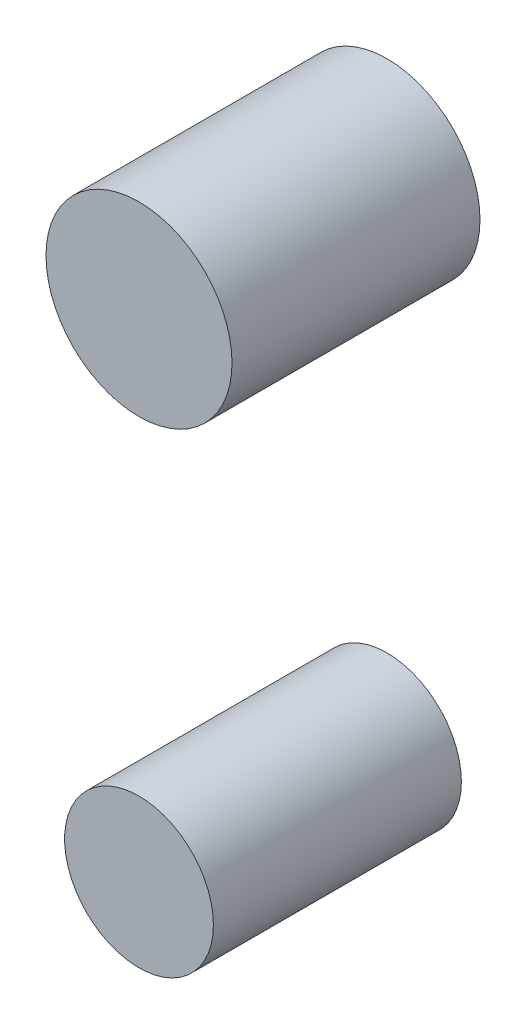
ISO-10303-21;
HEADER;
FILE_DESCRIPTION(('STEP AP214'),'2;1');
FILE_NAME('part.step','',(''),(''),'','','');
FILE_SCHEMA(('AUTOMOTIVE_DESIGN { 1 0 10303 214 1 1 1 1 }'));
ENDSEC;
DATA;
#1=APPLICATION_CONTEXT('core data for automotive mechanical design processes');
#2=APPLICATION_PROTOCOL_DEFINITION('international standard','automotive_design',2000,#1);
#3=PRODUCT_CONTEXT('',#1,'mechanical');
#4=PRODUCT('Part','Part','',(#3));
#5=PRODUCT_RELATED_PRODUCT_CATEGORY('part','',(#4));
#6=PRODUCT_DEFINITION_FORMATION('','',#4);
#7=PRODUCT_DEFINITION_CONTEXT('part definition',#1,'design');
#8=PRODUCT_DEFINITION('design','',#6,#7);
#9=PRODUCT_DEFINITION_SHAPE('','',#8);
#10=(LENGTH_UNIT() NAMED_UNIT(*) SI_UNIT(.MILLI.,.METRE.));
#11=(NAMED_UNIT(*) PLANE_ANGLE_UNIT() SI_UNIT($,.RADIAN.));
#12=(NAMED_UNIT(*) SI_UNIT($,.STERADIAN.) SOLID_ANGLE_UNIT());
#13=UNCERTAINTY_MEASURE_WITH_UNIT(LENGTH_MEASURE(1.E-05),#10,'distance_accuracy_value','');
#14=(GEOMETRIC_REPRESENTATION_CONTEXT(3) GLOBAL_UNCERTAINTY_ASSIGNED_CONTEXT((#13)) GLOBAL_UNIT_ASSIGNED_CONTEXT((#10,
#11,#12)) REPRESENTATION_CONTEXT('',''));
#15=CARTESIAN_POINT('',(0.,0.,0.));
#16=DIRECTION('',(0.,0.,1.));
#17=DIRECTION('',(1.,0.,0.));
#18=AXIS2_PLACEMENT_3D('',#15,#16,#17);
#19=CARTESIAN_POINT('',(0.,80.,-20.));
#20=DIRECTION('',(0.,0.,1.));
#21=DIRECTION('',(1.,0.,0.));
#22=AXIS2_PLACEMENT_3D('',#19,#20,#21);
#23=CYLINDRICAL_SURFACE('',#22,15.);
#24=CARTESIAN_POINT('',(0.,80.,-20.));
#25=DIRECTION('',(0.,0.,1.));
#26=DIRECTION('',(1.,0.,0.));
#27=AXIS2_PLACEMENT_3D('',#24,#25,#26);
#28=CIRCLE('',#27,15.);
#29=CARTESIAN_POINT('',(15.,80.,-20.));
#30=VERTEX_POINT('',#29);
#31=EDGE_CURVE('E55',#30,#30,#28,.T.);
#32=ORIENTED_EDGE('',*,*,#31,.T.);
#33=EDGE_LOOP('',(#32));
#34=FACE_BOUND('',#33,.T.);
#35=CARTESIAN_POINT('',(0.,80.,20.));
#36=DIRECTION('',(0.,0.,1.));
#37=DIRECTION('',(1.,0.,0.));
#38=AXIS2_PLACEMENT_3D('',#35,#36,#37);
#39=CIRCLE('',#38,15.);
#40=CARTESIAN_POINT('',(15.,80.,20.));
#41=VERTEX_POINT('',#40);
#42=EDGE_CURVE('E11',#41,#41,#39,.T.);
#43=ORIENTED_EDGE('',*,*,#42,.F.);
#44=EDGE_LOOP('',(#43));
#45=FACE_BOUND('',#44,.T.);
#46=ADVANCED_FACE('F44',(#34,#45),#23,.T.);
#47=CARTESIAN_POINT('',(0.,80.,-20.));
#48=DIRECTION('',(0.,0.,1.));
#49=DIRECTION('',(1.,0.,0.));
#50=AXIS2_PLACEMENT_3D('',#47,#48,#49);
#51=PLANE('',#50);
#52=ORIENTED_EDGE('',*,*,#31,.F.);
#53=EDGE_LOOP('',(#52));
#54=FACE_BOUND('',#53,.T.);
#55=ADVANCED_FACE('F58',(#54),#51,.F.);
#56=CARTESIAN_POINT('',(0.,80.,20.));
#57=DIRECTION('',(0.,0.,1.));
#58=DIRECTION('',(1.,0.,0.));
#59=AXIS2_PLACEMENT_3D('',#56,#57,#58);
#60=PLANE('',#59);
#61=ORIENTED_EDGE('',*,*,#42,.T.);
#62=EDGE_LOOP('',(#61));
#63=FACE_BOUND('',#62,.T.);
#64=ADVANCED_FACE('F50',(#63),#60,.T.);
#65=CLOSED_SHELL('',(#46,#55,#64));
#66=MANIFOLD_SOLID_BREP('B2',#65);
#67=CARTESIAN_POINT('',(0.,0.,-20.));
#68=DIRECTION('',(0.,0.,1.));
#69=DIRECTION('',(1.,0.,0.));
#70=AXIS2_PLACEMENT_3D('',#67,#68,#69);
#71=CYLINDRICAL_SURFACE('',#70,12.);
#72=CARTESIAN_POINT('',(0.,0.,-20.));
#73=DIRECTION('',(0.,0.,1.));
#74=DIRECTION('',(1.,0.,0.));
#75=AXIS2_PLACEMENT_3D('',#72,#73,#74);
#76=CIRCLE('',#75,12.);
#77=CARTESIAN_POINT('',(12.,0.,-20.));
#78=VERTEX_POINT('',#77);
#79=EDGE_CURVE('E42',#78,#78,#76,.T.);
#80=ORIENTED_EDGE('',*,*,#79,.T.);
#81=EDGE_LOOP('',(#80));
#82=FACE_BOUND('',#81,.T.);
#83=CARTESIAN_POINT('',(0.,0.,20.));
#84=DIRECTION('',(0.,0.,1.));
#85=DIRECTION('',(1.,0.,0.));
#86=AXIS2_PLACEMENT_3D('',#83,#84,#85);
#87=CIRCLE('',#86,12.);
#88=CARTESIAN_POINT('',(12.,0.,20.));
#89=VERTEX_POINT('',#88);
#90=EDGE_CURVE('E95',#89,#89,#87,.T.);
#91=ORIENTED_EDGE('',*,*,#90,.F.);
#92=EDGE_LOOP('',(#91));
#93=FACE_BOUND('',#92,.T.);
#94=ADVANCED_FACE('F88',(#82,#93),#71,.T.);
#95=CARTESIAN_POINT('',(0.,0.,-20.));
#96=DIRECTION('',(0.,0.,1.));
#97=DIRECTION('',(1.,0.,0.));
#98=AXIS2_PLACEMENT_3D('',#95,#96,#97);
#99=PLANE('',#98);
#100=ORIENTED_EDGE('',*,*,#79,.F.);
#101=EDGE_LOOP('',(#100));
#102=FACE_BOUND('',#101,.T.);
#103=ADVANCED_FACE('F101',(#102),#99,.F.);
#104=CARTESIAN_POINT('',(0.,0.,20.));
#105=DIRECTION('',(0.,0.,1.));
#106=DIRECTION('',(1.,0.,0.));
#107=AXIS2_PLACEMENT_3D('',#104,#105,#106);
#108=PLANE('',#107);
#109=ORIENTED_EDGE('',*,*,#90,.T.);
#110=EDGE_LOOP('',(#109));
#111=FACE_BOUND('',#110,.T.);
#112=ADVANCED_FACE('F98',(#111),#108,.T.);
#113=CLOSED_SHELL('',(#94,#103,#112));
#114=MANIFOLD_SOLID_BREP('B6',#113);
#115=ADVANCED_BREP_SHAPE_REPRESENTATION('',(#18,#66,#114),#14);
#116=SHAPE_DEFINITION_REPRESENTATION(#9,#115);
ENDSEC;
END-ISO-10303-21;
